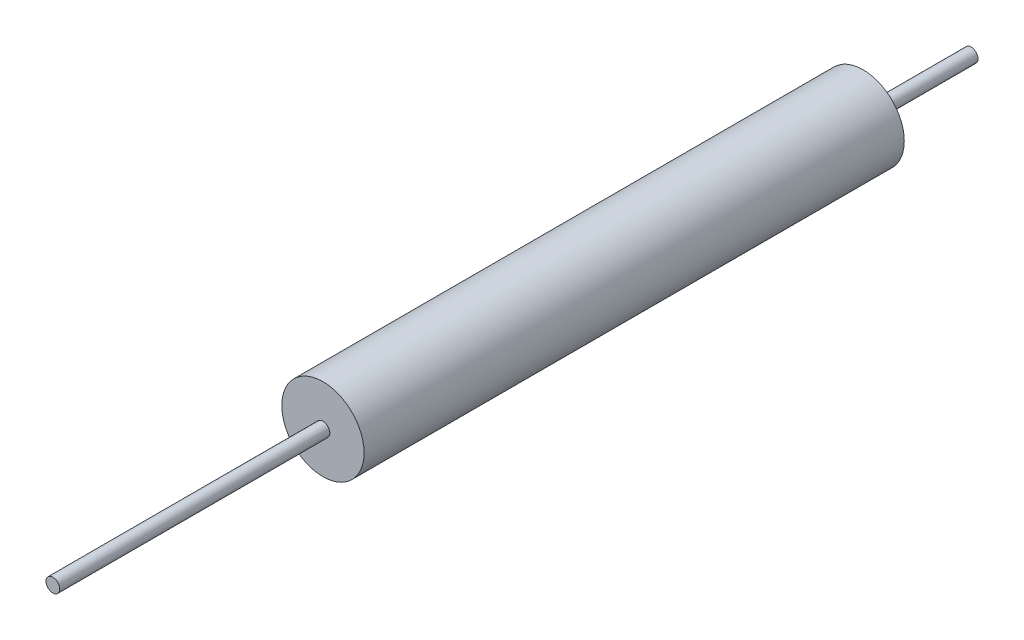
ISO-10303-21;
HEADER;
FILE_DESCRIPTION(('STEP AP214'),'2;1');
FILE_NAME('part.step','',(''),(''),'','','');
FILE_SCHEMA(('AUTOMOTIVE_DESIGN { 1 0 10303 214 1 1 1 1 }'));
ENDSEC;
DATA;
#1=APPLICATION_CONTEXT('core data for automotive mechanical design processes');
#2=APPLICATION_PROTOCOL_DEFINITION('international standard','automotive_design',2000,#1);
#3=PRODUCT_CONTEXT('',#1,'mechanical');
#4=PRODUCT('Part','Part','',(#3));
#5=PRODUCT_RELATED_PRODUCT_CATEGORY('part','',(#4));
#6=PRODUCT_DEFINITION_FORMATION('','',#4);
#7=PRODUCT_DEFINITION_CONTEXT('part definition',#1,'design');
#8=PRODUCT_DEFINITION('design','',#6,#7);
#9=PRODUCT_DEFINITION_SHAPE('','',#8);
#10=(LENGTH_UNIT() NAMED_UNIT(*) SI_UNIT(.MILLI.,.METRE.));
#11=(NAMED_UNIT(*) PLANE_ANGLE_UNIT() SI_UNIT($,.RADIAN.));
#12=(NAMED_UNIT(*) SI_UNIT($,.STERADIAN.) SOLID_ANGLE_UNIT());
#13=UNCERTAINTY_MEASURE_WITH_UNIT(LENGTH_MEASURE(1.E-05),#10,'distance_accuracy_value','');
#14=(GEOMETRIC_REPRESENTATION_CONTEXT(3) GLOBAL_UNCERTAINTY_ASSIGNED_CONTEXT((#13)) GLOBAL_UNIT_ASSIGNED_CONTEXT((#10,
#11,#12)) REPRESENTATION_CONTEXT('',''));
#15=CARTESIAN_POINT('',(0.,0.,0.));
#16=DIRECTION('',(0.,0.,1.));
#17=DIRECTION('',(1.,0.,0.));
#18=AXIS2_PLACEMENT_3D('',#15,#16,#17);
#19=CARTESIAN_POINT('',(0.,0.,250.));
#20=DIRECTION('',(0.,0.,-1.));
#21=DIRECTION('',(-1.,0.,0.));
#22=AXIS2_PLACEMENT_3D('',#19,#20,#21);
#23=CYLINDRICAL_SURFACE('',#22,19.05);
#24=CARTESIAN_POINT('',(0.,0.,250.));
#25=DIRECTION('',(0.,0.,1.));
#26=DIRECTION('',(1.,0.,0.));
#27=AXIS2_PLACEMENT_3D('',#24,#25,#26);
#28=CIRCLE('',#27,19.05);
#29=CARTESIAN_POINT('',(19.05,0.,250.));
#30=VERTEX_POINT('',#29);
#31=EDGE_CURVE('E53',#30,#30,#28,.T.);
#32=ORIENTED_EDGE('',*,*,#31,.F.);
#33=EDGE_LOOP('',(#32));
#34=FACE_BOUND('',#33,.T.);
#35=CARTESIAN_POINT('',(0.,0.,0.));
#36=DIRECTION('',(0.,0.,1.));
#37=DIRECTION('',(1.,0.,0.));
#38=AXIS2_PLACEMENT_3D('',#35,#36,#37);
#39=CIRCLE('',#38,19.05);
#40=CARTESIAN_POINT('',(19.05,0.,0.));
#41=VERTEX_POINT('',#40);
#42=EDGE_CURVE('E44',#41,#41,#39,.T.);
#43=ORIENTED_EDGE('',*,*,#42,.T.);
#44=EDGE_LOOP('',(#43));
#45=FACE_BOUND('',#44,.T.);
#46=ADVANCED_FACE('F41',(#34,#45),#23,.T.);
#47=CARTESIAN_POINT('',(0.,0.,250.));
#48=DIRECTION('',(0.,0.,1.));
#49=DIRECTION('',(1.,0.,0.));
#50=AXIS2_PLACEMENT_3D('',#47,#48,#49);
#51=PLANE('',#50);
#52=CARTESIAN_POINT('',(0.,0.,250.));
#53=DIRECTION('',(0.,0.,1.));
#54=DIRECTION('',(1.,0.,0.));
#55=AXIS2_PLACEMENT_3D('',#52,#53,#54);
#56=CIRCLE('',#55,3.175);
#57=CARTESIAN_POINT('',(3.175,0.,250.));
#58=VERTEX_POINT('',#57);
#59=EDGE_CURVE('E10',#58,#58,#56,.T.);
#60=ORIENTED_EDGE('',*,*,#59,.F.);
#61=EDGE_LOOP('',(#60));
#62=FACE_BOUND('',#61,.T.);
#63=ORIENTED_EDGE('',*,*,#31,.T.);
#64=EDGE_LOOP('',(#63));
#65=FACE_BOUND('',#64,.T.);
#66=ADVANCED_FACE('F70',(#62,#65),#51,.T.);
#67=CARTESIAN_POINT('',(0.,0.,0.));
#68=DIRECTION('',(0.,0.,1.));
#69=DIRECTION('',(1.,0.,0.));
#70=AXIS2_PLACEMENT_3D('',#67,#68,#69);
#71=PLANE('',#70);
#72=CARTESIAN_POINT('',(0.,0.,0.));
#73=DIRECTION('',(0.,0.,-1.));
#74=DIRECTION('',(-1.,0.,0.));
#75=AXIS2_PLACEMENT_3D('',#72,#73,#74);
#76=CIRCLE('',#75,3.175);
#77=CARTESIAN_POINT('',(-3.175,0.,0.));
#78=VERTEX_POINT('',#77);
#79=EDGE_CURVE('E48',#78,#78,#76,.T.);
#80=ORIENTED_EDGE('',*,*,#79,.F.);
#81=EDGE_LOOP('',(#80));
#82=FACE_BOUND('',#81,.T.);
#83=ORIENTED_EDGE('',*,*,#42,.F.);
#84=EDGE_LOOP('',(#83));
#85=FACE_BOUND('',#84,.T.);
#86=ADVANCED_FACE('F67',(#82,#85),#71,.F.);
#87=CARTESIAN_POINT('',(0.,0.,-50.));
#88=DIRECTION('',(0.,0.,1.));
#89=DIRECTION('',(1.,0.,0.));
#90=AXIS2_PLACEMENT_3D('',#87,#88,#89);
#91=CYLINDRICAL_SURFACE('',#90,3.175);
#92=CARTESIAN_POINT('',(0.,0.,-50.));
#93=DIRECTION('',(0.,0.,-1.));
#94=DIRECTION('',(-1.,0.,0.));
#95=AXIS2_PLACEMENT_3D('',#92,#93,#94);
#96=CIRCLE('',#95,3.175);
#97=CARTESIAN_POINT('',(-3.175,0.,-50.));
#98=VERTEX_POINT('',#97);
#99=EDGE_CURVE('E58',#98,#98,#96,.T.);
#100=ORIENTED_EDGE('',*,*,#99,.F.);
#101=EDGE_LOOP('',(#100));
#102=FACE_BOUND('',#101,.T.);
#103=ORIENTED_EDGE('',*,*,#79,.T.);
#104=EDGE_LOOP('',(#103));
#105=FACE_BOUND('',#104,.T.);
#106=ADVANCED_FACE('F69',(#102,#105),#91,.T.);
#107=CARTESIAN_POINT('',(0.,0.,-50.));
#108=DIRECTION('',(0.,0.,-1.));
#109=DIRECTION('',(-1.,0.,0.));
#110=AXIS2_PLACEMENT_3D('',#107,#108,#109);
#111=PLANE('',#110);
#112=ORIENTED_EDGE('',*,*,#99,.T.);
#113=EDGE_LOOP('',(#112));
#114=FACE_BOUND('',#113,.T.);
#115=ADVANCED_FACE('F76',(#114),#111,.T.);
#116=CARTESIAN_POINT('',(0.,0.,375.));
#117=DIRECTION('',(0.,0.,-1.));
#118=DIRECTION('',(-1.,0.,0.));
#119=AXIS2_PLACEMENT_3D('',#116,#117,#118);
#120=CYLINDRICAL_SURFACE('',#119,3.175);
#121=CARTESIAN_POINT('',(0.,0.,375.));
#122=DIRECTION('',(0.,0.,1.));
#123=DIRECTION('',(1.,0.,0.));
#124=AXIS2_PLACEMENT_3D('',#121,#122,#123);
#125=CIRCLE('',#124,3.175);
#126=CARTESIAN_POINT('',(3.175,0.,375.));
#127=VERTEX_POINT('',#126);
#128=EDGE_CURVE('E57',#127,#127,#125,.T.);
#129=ORIENTED_EDGE('',*,*,#128,.F.);
#130=EDGE_LOOP('',(#129));
#131=FACE_BOUND('',#130,.T.);
#132=ORIENTED_EDGE('',*,*,#59,.T.);
#133=EDGE_LOOP('',(#132));
#134=FACE_BOUND('',#133,.T.);
#135=ADVANCED_FACE('F113',(#131,#134),#120,.T.);
#136=CARTESIAN_POINT('',(0.,0.,375.));
#137=DIRECTION('',(0.,0.,1.));
#138=DIRECTION('',(1.,0.,0.));
#139=AXIS2_PLACEMENT_3D('',#136,#137,#138);
#140=PLANE('',#139);
#141=ORIENTED_EDGE('',*,*,#128,.T.);
#142=EDGE_LOOP('',(#141));
#143=FACE_BOUND('',#142,.T.);
#144=ADVANCED_FACE('F122',(#143),#140,.T.);
#145=CLOSED_SHELL('',(#46,#66,#86,#106,#115,#135,#144));
#146=MANIFOLD_SOLID_BREP('B2',#145);
#147=ADVANCED_BREP_SHAPE_REPRESENTATION('',(#18,#146),#14);
#148=SHAPE_DEFINITION_REPRESENTATION(#9,#147);
ENDSEC;
END-ISO-10303-21;
